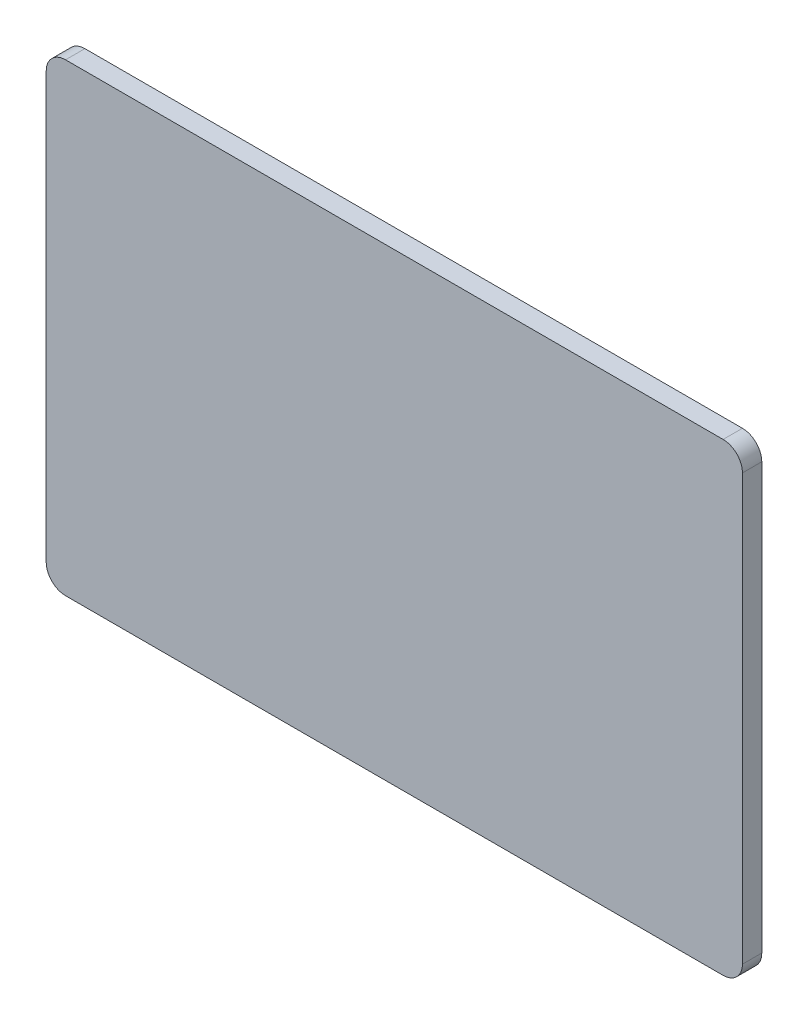
ISO-10303-21;
HEADER;
FILE_DESCRIPTION(('STEP AP214'),'2;1');
FILE_NAME('part.step','',(''),(''),'','','');
FILE_SCHEMA(('AUTOMOTIVE_DESIGN { 1 0 10303 214 1 1 1 1 }'));
ENDSEC;
DATA;
#1=APPLICATION_CONTEXT('core data for automotive mechanical design processes');
#2=APPLICATION_PROTOCOL_DEFINITION('international standard','automotive_design',2000,#1);
#3=PRODUCT_CONTEXT('',#1,'mechanical');
#4=PRODUCT('Part','Part','',(#3));
#5=PRODUCT_RELATED_PRODUCT_CATEGORY('part','',(#4));
#6=PRODUCT_DEFINITION_FORMATION('','',#4);
#7=PRODUCT_DEFINITION_CONTEXT('part definition',#1,'design');
#8=PRODUCT_DEFINITION('design','',#6,#7);
#9=PRODUCT_DEFINITION_SHAPE('','',#8);
#10=(LENGTH_UNIT() NAMED_UNIT(*) SI_UNIT(.MILLI.,.METRE.));
#11=(NAMED_UNIT(*) PLANE_ANGLE_UNIT() SI_UNIT($,.RADIAN.));
#12=(NAMED_UNIT(*) SI_UNIT($,.STERADIAN.) SOLID_ANGLE_UNIT());
#13=UNCERTAINTY_MEASURE_WITH_UNIT(LENGTH_MEASURE(1.E-05),#10,'distance_accuracy_value','');
#14=(GEOMETRIC_REPRESENTATION_CONTEXT(3) GLOBAL_UNCERTAINTY_ASSIGNED_CONTEXT((#13)) GLOBAL_UNIT_ASSIGNED_CONTEXT((#10,
#11,#12)) REPRESENTATION_CONTEXT('',''));
#15=CARTESIAN_POINT('',(0.,0.,0.));
#16=DIRECTION('',(0.,0.,1.));
#17=DIRECTION('',(1.,0.,0.));
#18=AXIS2_PLACEMENT_3D('',#15,#16,#17);
#19=CARTESIAN_POINT('',(114.3,0.,3.175));
#20=DIRECTION('',(-1.,0.,0.));
#21=DIRECTION('',(0.,1.,0.));
#22=AXIS2_PLACEMENT_3D('',#19,#20,#21);
#23=PLANE('',#22);
#24=DIRECTION('',(0.,1.,0.));
#25=VECTOR('',#24,1.);
#26=CARTESIAN_POINT('',(114.3,0.,3.175));
#27=LINE('',#26,#25);
#28=CARTESIAN_POINT('',(114.3,3.175,3.175));
#29=VERTEX_POINT('',#28);
#30=CARTESIAN_POINT('',(114.3,73.025,3.175));
#31=VERTEX_POINT('',#30);
#32=EDGE_CURVE('E156',#29,#31,#27,.T.);
#33=ORIENTED_EDGE('',*,*,#32,.F.);
#34=DIRECTION('',(0.,0.,-1.));
#35=VECTOR('',#34,1.);
#36=CARTESIAN_POINT('',(114.3,3.175,3.175));
#37=LINE('',#36,#35);
#38=CARTESIAN_POINT('',(114.3,3.175,0.));
#39=VERTEX_POINT('',#38);
#40=EDGE_CURVE('E131',#29,#39,#37,.T.);
#41=ORIENTED_EDGE('',*,*,#40,.T.);
#42=DIRECTION('',(0.,1.,0.));
#43=VECTOR('',#42,1.);
#44=CARTESIAN_POINT('',(114.3,0.,0.));
#45=LINE('',#44,#43);
#46=CARTESIAN_POINT('',(114.3,73.025,0.));
#47=VERTEX_POINT('',#46);
#48=EDGE_CURVE('E123',#39,#47,#45,.T.);
#49=ORIENTED_EDGE('',*,*,#48,.T.);
#50=DIRECTION('',(0.,0.,-1.));
#51=VECTOR('',#50,1.);
#52=CARTESIAN_POINT('',(114.3,73.025,3.175));
#53=LINE('',#52,#51);
#54=EDGE_CURVE('E171',#47,#31,#53,.F.);
#55=ORIENTED_EDGE('',*,*,#54,.T.);
#56=EDGE_LOOP('',(#33,#41,#49,#55));
#57=FACE_BOUND('',#56,.T.);
#58=ADVANCED_FACE('F36',(#57),#23,.F.);
#59=CARTESIAN_POINT('',(0.,76.2,3.175));
#60=DIRECTION('',(0.,-1.,0.));
#61=DIRECTION('',(-1.,0.,0.));
#62=AXIS2_PLACEMENT_3D('',#59,#60,#61);
#63=PLANE('',#62);
#64=DIRECTION('',(-1.,0.,0.));
#65=VECTOR('',#64,1.);
#66=CARTESIAN_POINT('',(0.,76.2,3.175));
#67=LINE('',#66,#65);
#68=CARTESIAN_POINT('',(111.125,76.2,3.175));
#69=VERTEX_POINT('',#68);
#70=CARTESIAN_POINT('',(3.175,76.2,3.175));
#71=VERTEX_POINT('',#70);
#72=EDGE_CURVE('E115',#69,#71,#67,.T.);
#73=ORIENTED_EDGE('',*,*,#72,.F.);
#74=DIRECTION('',(0.,0.,-1.));
#75=VECTOR('',#74,1.);
#76=CARTESIAN_POINT('',(111.125,76.2,3.175));
#77=LINE('',#76,#75);
#78=CARTESIAN_POINT('',(111.125,76.2,0.));
#79=VERTEX_POINT('',#78);
#80=EDGE_CURVE('E58',#69,#79,#77,.T.);
#81=ORIENTED_EDGE('',*,*,#80,.T.);
#82=DIRECTION('',(-1.,0.,0.));
#83=VECTOR('',#82,1.);
#84=CARTESIAN_POINT('',(0.,76.2,0.));
#85=LINE('',#84,#83);
#86=CARTESIAN_POINT('',(3.175,76.2,0.));
#87=VERTEX_POINT('',#86);
#88=EDGE_CURVE('E151',#79,#87,#85,.T.);
#89=ORIENTED_EDGE('',*,*,#88,.T.);
#90=DIRECTION('',(0.,0.,-1.));
#91=VECTOR('',#90,1.);
#92=CARTESIAN_POINT('',(3.175,76.2,3.175));
#93=LINE('',#92,#91);
#94=EDGE_CURVE('E136',#87,#71,#93,.F.);
#95=ORIENTED_EDGE('',*,*,#94,.T.);
#96=EDGE_LOOP('',(#73,#81,#89,#95));
#97=FACE_BOUND('',#96,.T.);
#98=ADVANCED_FACE('F150',(#97),#63,.F.);
#99=CARTESIAN_POINT('',(0.,0.,3.175));
#100=DIRECTION('',(1.,0.,0.));
#101=DIRECTION('',(0.,-1.,0.));
#102=AXIS2_PLACEMENT_3D('',#99,#100,#101);
#103=PLANE('',#102);
#104=DIRECTION('',(0.,1.,0.));
#105=VECTOR('',#104,1.);
#106=CARTESIAN_POINT('',(0.,0.,0.));
#107=LINE('',#106,#105);
#108=CARTESIAN_POINT('',(0.,73.025,0.));
#109=VERTEX_POINT('',#108);
#110=CARTESIAN_POINT('',(0.,3.175,0.));
#111=VERTEX_POINT('',#110);
#112=EDGE_CURVE('E124',#109,#111,#107,.F.);
#113=ORIENTED_EDGE('',*,*,#112,.T.);
#114=DIRECTION('',(0.,0.,-1.));
#115=VECTOR('',#114,1.);
#116=CARTESIAN_POINT('',(0.,3.175,3.175));
#117=LINE('',#116,#115);
#118=CARTESIAN_POINT('',(0.,3.175,3.175));
#119=VERTEX_POINT('',#118);
#120=EDGE_CURVE('E11',#111,#119,#117,.F.);
#121=ORIENTED_EDGE('',*,*,#120,.T.);
#122=DIRECTION('',(0.,-1.,0.));
#123=VECTOR('',#122,1.);
#124=CARTESIAN_POINT('',(0.,0.,3.175));
#125=LINE('',#124,#123);
#126=CARTESIAN_POINT('',(0.,73.025,3.175));
#127=VERTEX_POINT('',#126);
#128=EDGE_CURVE('E144',#127,#119,#125,.T.);
#129=ORIENTED_EDGE('',*,*,#128,.F.);
#130=DIRECTION('',(0.,0.,-1.));
#131=VECTOR('',#130,1.);
#132=CARTESIAN_POINT('',(0.,73.025,3.175));
#133=LINE('',#132,#131);
#134=EDGE_CURVE('E44',#127,#109,#133,.T.);
#135=ORIENTED_EDGE('',*,*,#134,.T.);
#136=EDGE_LOOP('',(#113,#121,#129,#135));
#137=FACE_BOUND('',#136,.T.);
#138=ADVANCED_FACE('F142',(#137),#103,.F.);
#139=CARTESIAN_POINT('',(0.,0.,3.175));
#140=DIRECTION('',(0.,1.,0.));
#141=DIRECTION('',(1.,0.,0.));
#142=AXIS2_PLACEMENT_3D('',#139,#140,#141);
#143=PLANE('',#142);
#144=DIRECTION('',(-1.,0.,0.));
#145=VECTOR('',#144,1.);
#146=CARTESIAN_POINT('',(0.,0.,0.));
#147=LINE('',#146,#145);
#148=CARTESIAN_POINT('',(3.175,0.,0.));
#149=VERTEX_POINT('',#148);
#150=CARTESIAN_POINT('',(111.125,0.,0.));
#151=VERTEX_POINT('',#150);
#152=EDGE_CURVE('E108',#149,#151,#147,.F.);
#153=ORIENTED_EDGE('',*,*,#152,.T.);
#154=DIRECTION('',(0.,0.,-1.));
#155=VECTOR('',#154,1.);
#156=CARTESIAN_POINT('',(111.125,0.,3.175));
#157=LINE('',#156,#155);
#158=CARTESIAN_POINT('',(111.125,0.,3.175));
#159=VERTEX_POINT('',#158);
#160=EDGE_CURVE('E114',#151,#159,#157,.F.);
#161=ORIENTED_EDGE('',*,*,#160,.T.);
#162=DIRECTION('',(1.,0.,0.));
#163=VECTOR('',#162,1.);
#164=CARTESIAN_POINT('',(0.,0.,3.175));
#165=LINE('',#164,#163);
#166=CARTESIAN_POINT('',(3.175,0.,3.175));
#167=VERTEX_POINT('',#166);
#168=EDGE_CURVE('E111',#167,#159,#165,.T.);
#169=ORIENTED_EDGE('',*,*,#168,.F.);
#170=DIRECTION('',(0.,0.,-1.));
#171=VECTOR('',#170,1.);
#172=CARTESIAN_POINT('',(3.175,0.,3.175));
#173=LINE('',#172,#171);
#174=EDGE_CURVE('E104',#167,#149,#173,.T.);
#175=ORIENTED_EDGE('',*,*,#174,.T.);
#176=EDGE_LOOP('',(#153,#161,#169,#175));
#177=FACE_BOUND('',#176,.T.);
#178=ADVANCED_FACE('F106',(#177),#143,.F.);
#179=CARTESIAN_POINT('',(0.,0.,3.175));
#180=DIRECTION('',(0.,0.,-1.));
#181=DIRECTION('',(-1.,0.,0.));
#182=AXIS2_PLACEMENT_3D('',#179,#180,#181);
#183=PLANE('',#182);
#184=ORIENTED_EDGE('',*,*,#168,.T.);
#185=CARTESIAN_POINT('',(111.125,3.175,3.175));
#186=DIRECTION('',(0.,0.,-1.));
#187=DIRECTION('',(-1.,0.,0.));
#188=AXIS2_PLACEMENT_3D('',#185,#186,#187);
#189=CIRCLE('',#188,3.175);
#190=EDGE_CURVE('E169',#159,#29,#189,.F.);
#191=ORIENTED_EDGE('',*,*,#190,.T.);
#192=ORIENTED_EDGE('',*,*,#32,.T.);
#193=CARTESIAN_POINT('',(111.125,73.025,3.175));
#194=DIRECTION('',(0.,0.,-1.));
#195=DIRECTION('',(-1.,0.,0.));
#196=AXIS2_PLACEMENT_3D('',#193,#194,#195);
#197=CIRCLE('',#196,3.175);
#198=EDGE_CURVE('E155',#31,#69,#197,.F.);
#199=ORIENTED_EDGE('',*,*,#198,.T.);
#200=ORIENTED_EDGE('',*,*,#72,.T.);
#201=CARTESIAN_POINT('',(3.175,73.025,3.175));
#202=DIRECTION('',(0.,0.,-1.));
#203=DIRECTION('',(-1.,0.,0.));
#204=AXIS2_PLACEMENT_3D('',#201,#202,#203);
#205=CIRCLE('',#204,3.175);
#206=EDGE_CURVE('E148',#71,#127,#205,.F.);
#207=ORIENTED_EDGE('',*,*,#206,.T.);
#208=ORIENTED_EDGE('',*,*,#128,.T.);
#209=CARTESIAN_POINT('',(3.175,3.175,3.175));
#210=DIRECTION('',(0.,0.,-1.));
#211=DIRECTION('',(-1.,0.,0.));
#212=AXIS2_PLACEMENT_3D('',#209,#210,#211);
#213=CIRCLE('',#212,3.175);
#214=EDGE_CURVE('E166',#119,#167,#213,.F.);
#215=ORIENTED_EDGE('',*,*,#214,.T.);
#216=EDGE_LOOP('',(#184,#191,#192,#199,#200,#207,#208,#215));
#217=FACE_BOUND('',#216,.T.);
#218=ADVANCED_FACE('F153',(#217),#183,.F.);
#219=CARTESIAN_POINT('',(0.,0.,0.));
#220=DIRECTION('',(0.,0.,-1.));
#221=DIRECTION('',(-1.,0.,0.));
#222=AXIS2_PLACEMENT_3D('',#219,#220,#221);
#223=PLANE('',#222);
#224=ORIENTED_EDGE('',*,*,#48,.F.);
#225=CARTESIAN_POINT('',(111.125,3.175,0.));
#226=DIRECTION('',(0.,0.,-1.));
#227=DIRECTION('',(-1.,0.,0.));
#228=AXIS2_PLACEMENT_3D('',#225,#226,#227);
#229=CIRCLE('',#228,3.175);
#230=EDGE_CURVE('E122',#39,#151,#229,.T.);
#231=ORIENTED_EDGE('',*,*,#230,.T.);
#232=ORIENTED_EDGE('',*,*,#152,.F.);
#233=CARTESIAN_POINT('',(3.175,3.175,0.));
#234=DIRECTION('',(0.,0.,-1.));
#235=DIRECTION('',(-1.,0.,0.));
#236=AXIS2_PLACEMENT_3D('',#233,#234,#235);
#237=CIRCLE('',#236,3.175);
#238=EDGE_CURVE('E119',#149,#111,#237,.T.);
#239=ORIENTED_EDGE('',*,*,#238,.T.);
#240=ORIENTED_EDGE('',*,*,#112,.F.);
#241=CARTESIAN_POINT('',(3.175,73.025,0.));
#242=DIRECTION('',(0.,0.,-1.));
#243=DIRECTION('',(-1.,0.,0.));
#244=AXIS2_PLACEMENT_3D('',#241,#242,#243);
#245=CIRCLE('',#244,3.175);
#246=EDGE_CURVE('E51',#109,#87,#245,.T.);
#247=ORIENTED_EDGE('',*,*,#246,.T.);
#248=ORIENTED_EDGE('',*,*,#88,.F.);
#249=CARTESIAN_POINT('',(111.125,73.025,0.));
#250=DIRECTION('',(0.,0.,-1.));
#251=DIRECTION('',(-1.,0.,0.));
#252=AXIS2_PLACEMENT_3D('',#249,#250,#251);
#253=CIRCLE('',#252,3.175);
#254=EDGE_CURVE('E128',#79,#47,#253,.T.);
#255=ORIENTED_EDGE('',*,*,#254,.T.);
#256=EDGE_LOOP('',(#224,#231,#232,#239,#240,#247,#248,#255));
#257=FACE_BOUND('',#256,.T.);
#258=ADVANCED_FACE('F118',(#257),#223,.T.);
#259=CARTESIAN_POINT('',(111.125,3.175,3.175));
#260=DIRECTION('',(0.,0.,1.));
#261=DIRECTION('',(1.,0.,0.));
#262=AXIS2_PLACEMENT_3D('',#259,#260,#261);
#263=CYLINDRICAL_SURFACE('',#262,3.175);
#264=ORIENTED_EDGE('',*,*,#230,.F.);
#265=ORIENTED_EDGE('',*,*,#40,.F.);
#266=ORIENTED_EDGE('',*,*,#190,.F.);
#267=ORIENTED_EDGE('',*,*,#160,.F.);
#268=EDGE_LOOP('',(#264,#265,#266,#267));
#269=FACE_BOUND('',#268,.T.);
#270=ADVANCED_FACE('F179',(#269),#263,.T.);
#271=CARTESIAN_POINT('',(111.125,73.025,3.175));
#272=DIRECTION('',(0.,0.,1.));
#273=DIRECTION('',(1.,0.,0.));
#274=AXIS2_PLACEMENT_3D('',#271,#272,#273);
#275=CYLINDRICAL_SURFACE('',#274,3.175);
#276=ORIENTED_EDGE('',*,*,#254,.F.);
#277=ORIENTED_EDGE('',*,*,#80,.F.);
#278=ORIENTED_EDGE('',*,*,#198,.F.);
#279=ORIENTED_EDGE('',*,*,#54,.F.);
#280=EDGE_LOOP('',(#276,#277,#278,#279));
#281=FACE_BOUND('',#280,.T.);
#282=ADVANCED_FACE('F182',(#281),#275,.T.);
#283=CARTESIAN_POINT('',(3.175,3.175,3.175));
#284=DIRECTION('',(0.,0.,1.));
#285=DIRECTION('',(1.,0.,0.));
#286=AXIS2_PLACEMENT_3D('',#283,#284,#285);
#287=CYLINDRICAL_SURFACE('',#286,3.175);
#288=ORIENTED_EDGE('',*,*,#238,.F.);
#289=ORIENTED_EDGE('',*,*,#174,.F.);
#290=ORIENTED_EDGE('',*,*,#214,.F.);
#291=ORIENTED_EDGE('',*,*,#120,.F.);
#292=EDGE_LOOP('',(#288,#289,#290,#291));
#293=FACE_BOUND('',#292,.T.);
#294=ADVANCED_FACE('F127',(#293),#287,.T.);
#295=CARTESIAN_POINT('',(3.175,73.025,3.175));
#296=DIRECTION('',(0.,0.,1.));
#297=DIRECTION('',(1.,0.,0.));
#298=AXIS2_PLACEMENT_3D('',#295,#296,#297);
#299=CYLINDRICAL_SURFACE('',#298,3.175);
#300=ORIENTED_EDGE('',*,*,#246,.F.);
#301=ORIENTED_EDGE('',*,*,#134,.F.);
#302=ORIENTED_EDGE('',*,*,#206,.F.);
#303=ORIENTED_EDGE('',*,*,#94,.F.);
#304=EDGE_LOOP('',(#300,#301,#302,#303));
#305=FACE_BOUND('',#304,.T.);
#306=ADVANCED_FACE('F38',(#305),#299,.T.);
#307=CLOSED_SHELL('',(#58,#98,#138,#178,#218,#258,#270,#282,#294,#306));
#308=MANIFOLD_SOLID_BREP('B2',#307);
#309=ADVANCED_BREP_SHAPE_REPRESENTATION('',(#18,#308),#14);
#310=SHAPE_DEFINITION_REPRESENTATION(#9,#309);
ENDSEC;
END-ISO-10303-21;
